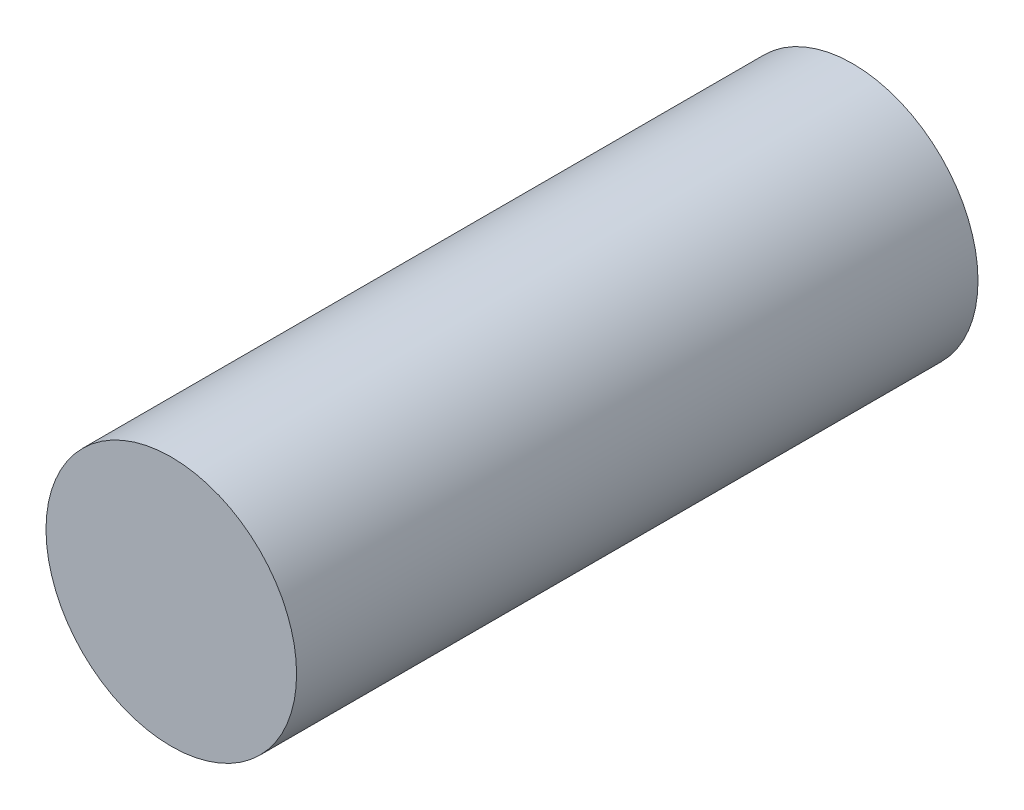
ISO-10303-21;
HEADER;
FILE_DESCRIPTION(('STEP AP214'),'2;1');
FILE_NAME('part.step','',(''),(''),'','','');
FILE_SCHEMA(('AUTOMOTIVE_DESIGN { 1 0 10303 214 1 1 1 1 }'));
ENDSEC;
DATA;
#1=APPLICATION_CONTEXT('core data for automotive mechanical design processes');
#2=APPLICATION_PROTOCOL_DEFINITION('international standard','automotive_design',2000,#1);
#3=PRODUCT_CONTEXT('',#1,'mechanical');
#4=PRODUCT('Part','Part','',(#3));
#5=PRODUCT_RELATED_PRODUCT_CATEGORY('part','',(#4));
#6=PRODUCT_DEFINITION_FORMATION('','',#4);
#7=PRODUCT_DEFINITION_CONTEXT('part definition',#1,'design');
#8=PRODUCT_DEFINITION('design','',#6,#7);
#9=PRODUCT_DEFINITION_SHAPE('','',#8);
#10=(LENGTH_UNIT() NAMED_UNIT(*) SI_UNIT(.MILLI.,.METRE.));
#11=(NAMED_UNIT(*) PLANE_ANGLE_UNIT() SI_UNIT($,.RADIAN.));
#12=(NAMED_UNIT(*) SI_UNIT($,.STERADIAN.) SOLID_ANGLE_UNIT());
#13=UNCERTAINTY_MEASURE_WITH_UNIT(LENGTH_MEASURE(1.E-05),#10,'distance_accuracy_value','');
#14=(GEOMETRIC_REPRESENTATION_CONTEXT(3) GLOBAL_UNCERTAINTY_ASSIGNED_CONTEXT((#13)) GLOBAL_UNIT_ASSIGNED_CONTEXT((#10,
#11,#12)) REPRESENTATION_CONTEXT('',''));
#15=CARTESIAN_POINT('',(0.,0.,0.));
#16=DIRECTION('',(0.,0.,1.));
#17=DIRECTION('',(1.,0.,0.));
#18=AXIS2_PLACEMENT_3D('',#15,#16,#17);
#19=CARTESIAN_POINT('',(0.,0.,43.4));
#20=DIRECTION('',(0.,0.,-1.));
#21=DIRECTION('',(-1.,0.,0.));
#22=AXIS2_PLACEMENT_3D('',#19,#20,#21);
#23=CYLINDRICAL_SURFACE('',#22,7.98);
#24=CARTESIAN_POINT('',(0.,0.,43.4));
#25=DIRECTION('',(0.,0.,1.));
#26=DIRECTION('',(1.,0.,0.));
#27=AXIS2_PLACEMENT_3D('',#24,#25,#26);
#28=CIRCLE('',#27,7.98);
#29=CARTESIAN_POINT('',(7.98,0.,43.4));
#30=VERTEX_POINT('',#29);
#31=EDGE_CURVE('E10',#30,#30,#28,.T.);
#32=ORIENTED_EDGE('',*,*,#31,.F.);
#33=EDGE_LOOP('',(#32));
#34=FACE_BOUND('',#33,.T.);
#35=CARTESIAN_POINT('',(0.,0.,0.));
#36=DIRECTION('',(0.,0.,1.));
#37=DIRECTION('',(1.,0.,0.));
#38=AXIS2_PLACEMENT_3D('',#35,#36,#37);
#39=CIRCLE('',#38,7.98);
#40=CARTESIAN_POINT('',(7.98,0.,0.));
#41=VERTEX_POINT('',#40);
#42=EDGE_CURVE('E42',#41,#41,#39,.T.);
#43=ORIENTED_EDGE('',*,*,#42,.T.);
#44=EDGE_LOOP('',(#43));
#45=FACE_BOUND('',#44,.T.);
#46=ADVANCED_FACE('F39',(#34,#45),#23,.T.);
#47=CARTESIAN_POINT('',(0.,0.,43.4));
#48=DIRECTION('',(0.,0.,1.));
#49=DIRECTION('',(1.,0.,0.));
#50=AXIS2_PLACEMENT_3D('',#47,#48,#49);
#51=PLANE('',#50);
#52=ORIENTED_EDGE('',*,*,#31,.T.);
#53=EDGE_LOOP('',(#52));
#54=FACE_BOUND('',#53,.T.);
#55=ADVANCED_FACE('F54',(#54),#51,.T.);
#56=CARTESIAN_POINT('',(0.,0.,0.));
#57=DIRECTION('',(0.,0.,1.));
#58=DIRECTION('',(1.,0.,0.));
#59=AXIS2_PLACEMENT_3D('',#56,#57,#58);
#60=PLANE('',#59);
#61=ORIENTED_EDGE('',*,*,#42,.F.);
#62=EDGE_LOOP('',(#61));
#63=FACE_BOUND('',#62,.T.);
#64=ADVANCED_FACE('F52',(#63),#60,.F.);
#65=CLOSED_SHELL('',(#46,#55,#64));
#66=MANIFOLD_SOLID_BREP('B2',#65);
#67=ADVANCED_BREP_SHAPE_REPRESENTATION('',(#18,#66),#14);
#68=SHAPE_DEFINITION_REPRESENTATION(#9,#67);
ENDSEC;
END-ISO-10303-21;
